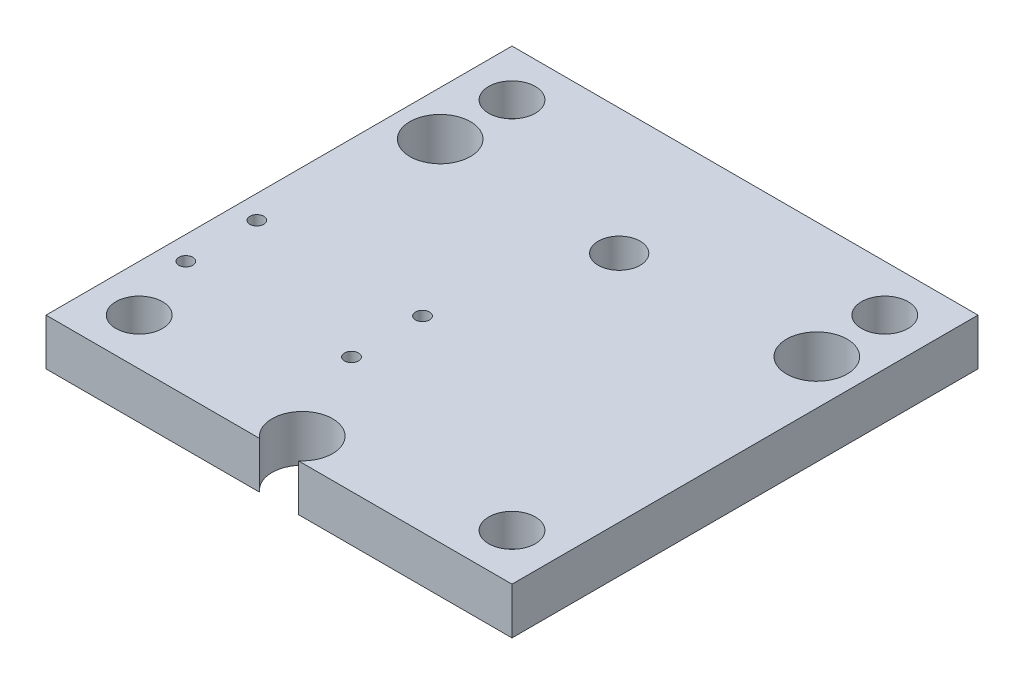
ISO-10303-21;
HEADER;
FILE_DESCRIPTION(('STEP AP214'),'2;1');
FILE_NAME('part.step','',(''),(''),'','','');
FILE_SCHEMA(('AUTOMOTIVE_DESIGN { 1 0 10303 214 1 1 1 1 }'));
ENDSEC;
DATA;
#1=APPLICATION_CONTEXT('core data for automotive mechanical design processes');
#2=APPLICATION_PROTOCOL_DEFINITION('international standard','automotive_design',2000,#1);
#3=PRODUCT_CONTEXT('',#1,'mechanical');
#4=PRODUCT('Part','Part','',(#3));
#5=PRODUCT_RELATED_PRODUCT_CATEGORY('part','',(#4));
#6=PRODUCT_DEFINITION_FORMATION('','',#4);
#7=PRODUCT_DEFINITION_CONTEXT('part definition',#1,'design');
#8=PRODUCT_DEFINITION('design','',#6,#7);
#9=PRODUCT_DEFINITION_SHAPE('','',#8);
#10=(LENGTH_UNIT() NAMED_UNIT(*) SI_UNIT(.MILLI.,.METRE.));
#11=(NAMED_UNIT(*) PLANE_ANGLE_UNIT() SI_UNIT($,.RADIAN.));
#12=(NAMED_UNIT(*) SI_UNIT($,.STERADIAN.) SOLID_ANGLE_UNIT());
#13=UNCERTAINTY_MEASURE_WITH_UNIT(LENGTH_MEASURE(1.E-05),#10,'distance_accuracy_value','');
#14=(GEOMETRIC_REPRESENTATION_CONTEXT(3) GLOBAL_UNCERTAINTY_ASSIGNED_CONTEXT((#13)) GLOBAL_UNIT_ASSIGNED_CONTEXT((#10,
#11,#12)) REPRESENTATION_CONTEXT('',''));
#15=CARTESIAN_POINT('',(0.,0.,0.));
#16=DIRECTION('',(0.,0.,1.));
#17=DIRECTION('',(1.,0.,0.));
#18=AXIS2_PLACEMENT_3D('',#15,#16,#17);
#19=CARTESIAN_POINT('',(50.,0.,27.));
#20=DIRECTION('',(0.,1.,0.));
#21=DIRECTION('',(0.,0.,1.));
#22=AXIS2_PLACEMENT_3D('',#19,#20,#21);
#23=CYLINDRICAL_SURFACE('',#22,4.5);
#24=CARTESIAN_POINT('',(50.,10.,27.));
#25=DIRECTION('',(0.,1.,0.));
#26=DIRECTION('',(0.,0.,1.));
#27=AXIS2_PLACEMENT_3D('',#24,#25,#26);
#28=CIRCLE('',#27,4.5);
#29=CARTESIAN_POINT('',(50.,10.,31.5));
#30=VERTEX_POINT('',#29);
#31=EDGE_CURVE('E197',#30,#30,#28,.T.);
#32=ORIENTED_EDGE('',*,*,#31,.T.);
#33=EDGE_LOOP('',(#32));
#34=FACE_BOUND('',#33,.T.);
#35=CARTESIAN_POINT('',(50.,3.,27.));
#36=DIRECTION('',(0.,-1.,0.));
#37=DIRECTION('',(0.,0.,-1.));
#38=AXIS2_PLACEMENT_3D('',#35,#36,#37);
#39=CIRCLE('',#38,4.5);
#40=CARTESIAN_POINT('',(50.,3.,22.5));
#41=VERTEX_POINT('',#40);
#42=EDGE_CURVE('E43',#41,#41,#39,.F.);
#43=ORIENTED_EDGE('',*,*,#42,.F.);
#44=EDGE_LOOP('',(#43));
#45=FACE_BOUND('',#44,.T.);
#46=ADVANCED_FACE('F39',(#34,#45),#23,.F.);
#47=CARTESIAN_POINT('',(0.,10.,100.));
#48=DIRECTION('',(0.,0.,-1.));
#49=DIRECTION('',(-1.,0.,0.));
#50=AXIS2_PLACEMENT_3D('',#47,#48,#49);
#51=PLANE('',#50);
#52=DIRECTION('',(1.,0.,0.));
#53=VECTOR('',#52,1.);
#54=CARTESIAN_POINT('',(0.,0.,100.));
#55=LINE('',#54,#53);
#56=CARTESIAN_POINT('',(0.,0.,100.));
#57=VERTEX_POINT('',#56);
#58=CARTESIAN_POINT('',(45.846688068541,0.,100.));
#59=VERTEX_POINT('',#58);
#60=EDGE_CURVE('E124',#57,#59,#55,.T.);
#61=ORIENTED_EDGE('',*,*,#60,.T.);
#62=DIRECTION('',(0.,1.,0.));
#63=VECTOR('',#62,1.);
#64=CARTESIAN_POINT('',(45.846688068541,0.,100.));
#65=LINE('',#64,#63);
#66=CARTESIAN_POINT('',(45.846688068541,10.,100.));
#67=VERTEX_POINT('',#66);
#68=EDGE_CURVE('E56',#59,#67,#65,.T.);
#69=ORIENTED_EDGE('',*,*,#68,.T.);
#70=DIRECTION('',(1.,0.,0.));
#71=VECTOR('',#70,1.);
#72=CARTESIAN_POINT('',(0.,10.,100.));
#73=LINE('',#72,#71);
#74=CARTESIAN_POINT('',(0.,10.,100.));
#75=VERTEX_POINT('',#74);
#76=EDGE_CURVE('E92',#75,#67,#73,.T.);
#77=ORIENTED_EDGE('',*,*,#76,.F.);
#78=DIRECTION('',(0.,-1.,0.));
#79=VECTOR('',#78,1.);
#80=CARTESIAN_POINT('',(0.,10.,100.));
#81=LINE('',#80,#79);
#82=EDGE_CURVE('E11',#75,#57,#81,.T.);
#83=ORIENTED_EDGE('',*,*,#82,.T.);
#84=EDGE_LOOP('',(#61,#69,#77,#83));
#85=FACE_BOUND('',#84,.T.);
#86=ADVANCED_FACE('F334',(#85),#51,.F.);
#87=CARTESIAN_POINT('',(0.,10.,0.));
#88=DIRECTION('',(1.,0.,0.));
#89=DIRECTION('',(0.,0.,-1.));
#90=AXIS2_PLACEMENT_3D('',#87,#88,#89);
#91=PLANE('',#90);
#92=DIRECTION('',(0.,0.,1.));
#93=VECTOR('',#92,1.);
#94=CARTESIAN_POINT('',(0.,0.,0.));
#95=LINE('',#94,#93);
#96=CARTESIAN_POINT('',(0.,0.,0.));
#97=VERTEX_POINT('',#96);
#98=EDGE_CURVE('E125',#97,#57,#95,.T.);
#99=ORIENTED_EDGE('',*,*,#98,.T.);
#100=ORIENTED_EDGE('',*,*,#82,.F.);
#101=DIRECTION('',(0.,0.,1.));
#102=VECTOR('',#101,1.);
#103=CARTESIAN_POINT('',(0.,10.,0.));
#104=LINE('',#103,#102);
#105=CARTESIAN_POINT('',(0.,10.,0.));
#106=VERTEX_POINT('',#105);
#107=EDGE_CURVE('E138',#106,#75,#104,.T.);
#108=ORIENTED_EDGE('',*,*,#107,.F.);
#109=DIRECTION('',(0.,-1.,0.));
#110=VECTOR('',#109,1.);
#111=CARTESIAN_POINT('',(0.,10.,0.));
#112=LINE('',#111,#110);
#113=EDGE_CURVE('E139',#106,#97,#112,.T.);
#114=ORIENTED_EDGE('',*,*,#113,.T.);
#115=EDGE_LOOP('',(#99,#100,#108,#114));
#116=FACE_BOUND('',#115,.T.);
#117=ADVANCED_FACE('F41',(#116),#91,.F.);
#118=CARTESIAN_POINT('',(54.153311931459,10.,100.));
#119=VERTEX_POINT('',#118);
#120=CARTESIAN_POINT('',(100.,10.,100.));
#121=VERTEX_POINT('',#120);
#122=EDGE_CURVE('E117',#119,#121,#73,.T.);
#123=ORIENTED_EDGE('',*,*,#122,.F.);
#124=DIRECTION('',(0.,1.,0.));
#125=VECTOR('',#124,1.);
#126=CARTESIAN_POINT('',(54.153311931459,0.,100.));
#127=LINE('',#126,#125);
#128=CARTESIAN_POINT('',(54.153311931459,0.,100.));
#129=VERTEX_POINT('',#128);
#130=EDGE_CURVE('E103',#119,#129,#127,.F.);
#131=ORIENTED_EDGE('',*,*,#130,.T.);
#132=CARTESIAN_POINT('',(100.,0.,100.));
#133=VERTEX_POINT('',#132);
#134=EDGE_CURVE('E115',#129,#133,#55,.T.);
#135=ORIENTED_EDGE('',*,*,#134,.T.);
#136=DIRECTION('',(0.,-1.,0.));
#137=VECTOR('',#136,1.);
#138=CARTESIAN_POINT('',(100.,10.,100.));
#139=LINE('',#138,#137);
#140=EDGE_CURVE('E49',#121,#133,#139,.T.);
#141=ORIENTED_EDGE('',*,*,#140,.F.);
#142=EDGE_LOOP('',(#123,#131,#135,#141));
#143=FACE_BOUND('',#142,.T.);
#144=ADVANCED_FACE('F113',(#143),#51,.F.);
#145=CARTESIAN_POINT('',(100.,10.,0.));
#146=DIRECTION('',(-1.,0.,0.));
#147=DIRECTION('',(0.,0.,1.));
#148=AXIS2_PLACEMENT_3D('',#145,#146,#147);
#149=PLANE('',#148);
#150=DIRECTION('',(0.,0.,-1.));
#151=VECTOR('',#150,1.);
#152=CARTESIAN_POINT('',(100.,0.,0.));
#153=LINE('',#152,#151);
#154=CARTESIAN_POINT('',(100.,0.,0.));
#155=VERTEX_POINT('',#154);
#156=EDGE_CURVE('E122',#133,#155,#153,.T.);
#157=ORIENTED_EDGE('',*,*,#156,.T.);
#158=DIRECTION('',(0.,-1.,0.));
#159=VECTOR('',#158,1.);
#160=CARTESIAN_POINT('',(100.,10.,0.));
#161=LINE('',#160,#159);
#162=CARTESIAN_POINT('',(100.,10.,0.));
#163=VERTEX_POINT('',#162);
#164=EDGE_CURVE('E142',#163,#155,#161,.T.);
#165=ORIENTED_EDGE('',*,*,#164,.F.);
#166=DIRECTION('',(0.,0.,-1.));
#167=VECTOR('',#166,1.);
#168=CARTESIAN_POINT('',(100.,10.,0.));
#169=LINE('',#168,#167);
#170=EDGE_CURVE('E150',#121,#163,#169,.T.);
#171=ORIENTED_EDGE('',*,*,#170,.F.);
#172=ORIENTED_EDGE('',*,*,#140,.T.);
#173=EDGE_LOOP('',(#157,#165,#171,#172));
#174=FACE_BOUND('',#173,.T.);
#175=ADVANCED_FACE('F148',(#174),#149,.F.);
#176=CARTESIAN_POINT('',(0.,10.,0.));
#177=DIRECTION('',(0.,0.,1.));
#178=DIRECTION('',(1.,0.,0.));
#179=AXIS2_PLACEMENT_3D('',#176,#177,#178);
#180=PLANE('',#179);
#181=DIRECTION('',(-1.,0.,0.));
#182=VECTOR('',#181,1.);
#183=CARTESIAN_POINT('',(0.,0.,0.));
#184=LINE('',#183,#182);
#185=EDGE_CURVE('E86',#155,#97,#184,.T.);
#186=ORIENTED_EDGE('',*,*,#185,.T.);
#187=ORIENTED_EDGE('',*,*,#113,.F.);
#188=DIRECTION('',(-1.,0.,0.));
#189=VECTOR('',#188,1.);
#190=CARTESIAN_POINT('',(0.,10.,0.));
#191=LINE('',#190,#189);
#192=EDGE_CURVE('E65',#163,#106,#191,.T.);
#193=ORIENTED_EDGE('',*,*,#192,.F.);
#194=ORIENTED_EDGE('',*,*,#164,.T.);
#195=EDGE_LOOP('',(#186,#187,#193,#194));
#196=FACE_BOUND('',#195,.T.);
#197=ADVANCED_FACE('F311',(#196),#180,.F.);
#198=CARTESIAN_POINT('',(0.,10.,0.));
#199=DIRECTION('',(0.,1.,0.));
#200=DIRECTION('',(0.,0.,1.));
#201=AXIS2_PLACEMENT_3D('',#198,#199,#200);
#202=PLANE('',#201);
#203=CARTESIAN_POINT('',(40.56,10.,75.));
#204=DIRECTION('',(0.,1.,0.));
#205=DIRECTION('',(0.,0.,1.));
#206=AXIS2_PLACEMENT_3D('',#203,#204,#205);
#207=CIRCLE('',#206,1.5);
#208=CARTESIAN_POINT('',(40.56,10.,76.5));
#209=VERTEX_POINT('',#208);
#210=EDGE_CURVE('E240',#209,#209,#207,.T.);
#211=ORIENTED_EDGE('',*,*,#210,.F.);
#212=EDGE_LOOP('',(#211));
#213=FACE_BOUND('',#212,.T.);
#214=CARTESIAN_POINT('',(5.,10.,59.76));
#215=DIRECTION('',(0.,1.,0.));
#216=DIRECTION('',(0.,0.,1.));
#217=AXIS2_PLACEMENT_3D('',#214,#215,#216);
#218=CIRCLE('',#217,1.5);
#219=CARTESIAN_POINT('',(5.,10.,61.26));
#220=VERTEX_POINT('',#219);
#221=EDGE_CURVE('E231',#220,#220,#218,.T.);
#222=ORIENTED_EDGE('',*,*,#221,.F.);
#223=EDGE_LOOP('',(#222));
#224=FACE_BOUND('',#223,.T.);
#225=CARTESIAN_POINT('',(5.,10.,75.));
#226=DIRECTION('',(0.,1.,0.));
#227=DIRECTION('',(0.,0.,1.));
#228=AXIS2_PLACEMENT_3D('',#225,#226,#227);
#229=CIRCLE('',#228,1.5);
#230=CARTESIAN_POINT('',(5.,10.,76.5));
#231=VERTEX_POINT('',#230);
#232=EDGE_CURVE('E247',#231,#231,#229,.T.);
#233=ORIENTED_EDGE('',*,*,#232,.F.);
#234=EDGE_LOOP('',(#233));
#235=FACE_BOUND('',#234,.T.);
#236=CARTESIAN_POINT('',(40.56,10.,59.76));
#237=DIRECTION('',(0.,1.,0.));
#238=DIRECTION('',(0.,0.,1.));
#239=AXIS2_PLACEMENT_3D('',#236,#237,#238);
#240=CIRCLE('',#239,1.5);
#241=CARTESIAN_POINT('',(40.56,10.,61.26));
#242=VERTEX_POINT('',#241);
#243=EDGE_CURVE('E223',#242,#242,#240,.T.);
#244=ORIENTED_EDGE('',*,*,#243,.F.);
#245=EDGE_LOOP('',(#244));
#246=FACE_BOUND('',#245,.T.);
#247=ORIENTED_EDGE('',*,*,#31,.F.);
#248=EDGE_LOOP('',(#247));
#249=FACE_BOUND('',#248,.T.);
#250=CARTESIAN_POINT('',(50.,10.,95.));
#251=DIRECTION('',(0.,1.,0.));
#252=DIRECTION('',(0.,0.,1.));
#253=AXIS2_PLACEMENT_3D('',#250,#251,#252);
#254=CIRCLE('',#253,6.5);
#255=EDGE_CURVE('E109',#119,#67,#254,.T.);
#256=ORIENTED_EDGE('',*,*,#255,.F.);
#257=ORIENTED_EDGE('',*,*,#122,.T.);
#258=ORIENTED_EDGE('',*,*,#170,.T.);
#259=ORIENTED_EDGE('',*,*,#192,.T.);
#260=ORIENTED_EDGE('',*,*,#107,.T.);
#261=ORIENTED_EDGE('',*,*,#76,.T.);
#262=EDGE_LOOP('',(#256,#257,#258,#259,#260,#261));
#263=FACE_BOUND('',#262,.T.);
#264=CARTESIAN_POINT('',(90.4145188432738,10.,25.));
#265=DIRECTION('',(0.,1.,0.));
#266=DIRECTION('',(0.,0.,1.));
#267=AXIS2_PLACEMENT_3D('',#264,#265,#266);
#268=CIRCLE('',#267,6.5);
#269=CARTESIAN_POINT('',(90.4145188432738,10.,31.5));
#270=VERTEX_POINT('',#269);
#271=EDGE_CURVE('E201',#270,#270,#268,.T.);
#272=ORIENTED_EDGE('',*,*,#271,.F.);
#273=EDGE_LOOP('',(#272));
#274=FACE_BOUND('',#273,.T.);
#275=CARTESIAN_POINT('',(9.58548115672619,10.,25.));
#276=DIRECTION('',(0.,1.,0.));
#277=DIRECTION('',(0.,0.,1.));
#278=AXIS2_PLACEMENT_3D('',#275,#276,#277);
#279=CIRCLE('',#278,6.5);
#280=CARTESIAN_POINT('',(9.58548115672619,10.,31.5));
#281=VERTEX_POINT('',#280);
#282=EDGE_CURVE('E192',#281,#281,#279,.T.);
#283=ORIENTED_EDGE('',*,*,#282,.F.);
#284=EDGE_LOOP('',(#283));
#285=FACE_BOUND('',#284,.T.);
#286=CARTESIAN_POINT('',(90.,10.,9.99999999999998));
#287=DIRECTION('',(0.,1.,0.));
#288=DIRECTION('',(0.,0.,1.));
#289=AXIS2_PLACEMENT_3D('',#286,#287,#288);
#290=CIRCLE('',#289,5.);
#291=CARTESIAN_POINT('',(90.,10.,15.));
#292=VERTEX_POINT('',#291);
#293=EDGE_CURVE('E176',#292,#292,#290,.T.);
#294=ORIENTED_EDGE('',*,*,#293,.F.);
#295=EDGE_LOOP('',(#294));
#296=FACE_BOUND('',#295,.T.);
#297=CARTESIAN_POINT('',(10.,10.,90.));
#298=DIRECTION('',(0.,1.,0.));
#299=DIRECTION('',(0.,0.,1.));
#300=AXIS2_PLACEMENT_3D('',#297,#298,#299);
#301=CIRCLE('',#300,5.);
#302=CARTESIAN_POINT('',(10.,10.,95.));
#303=VERTEX_POINT('',#302);
#304=EDGE_CURVE('E167',#303,#303,#301,.T.);
#305=ORIENTED_EDGE('',*,*,#304,.F.);
#306=EDGE_LOOP('',(#305));
#307=FACE_BOUND('',#306,.T.);
#308=CARTESIAN_POINT('',(90.,10.,90.));
#309=DIRECTION('',(0.,1.,0.));
#310=DIRECTION('',(0.,0.,1.));
#311=AXIS2_PLACEMENT_3D('',#308,#309,#310);
#312=CIRCLE('',#311,5.00000000000001);
#313=CARTESIAN_POINT('',(90.,10.,95.));
#314=VERTEX_POINT('',#313);
#315=EDGE_CURVE('E183',#314,#314,#312,.T.);
#316=ORIENTED_EDGE('',*,*,#315,.F.);
#317=EDGE_LOOP('',(#316));
#318=FACE_BOUND('',#317,.T.);
#319=CARTESIAN_POINT('',(9.99999999999999,10.,10.));
#320=DIRECTION('',(0.,1.,0.));
#321=DIRECTION('',(0.,0.,1.));
#322=AXIS2_PLACEMENT_3D('',#319,#320,#321);
#323=CIRCLE('',#322,5.);
#324=CARTESIAN_POINT('',(9.99999999999999,10.,15.));
#325=VERTEX_POINT('',#324);
#326=EDGE_CURVE('E159',#325,#325,#323,.T.);
#327=ORIENTED_EDGE('',*,*,#326,.F.);
#328=EDGE_LOOP('',(#327));
#329=FACE_BOUND('',#328,.T.);
#330=ADVANCED_FACE('F283',(#213,#224,#235,#246,#249,#263,#274,#285,#296,#307,#318,#329),#202,.T.);
#331=CARTESIAN_POINT('',(0.,0.,0.));
#332=DIRECTION('',(0.,1.,0.));
#333=DIRECTION('',(0.,0.,1.));
#334=AXIS2_PLACEMENT_3D('',#331,#332,#333);
#335=PLANE('',#334);
#336=CARTESIAN_POINT('',(65.,0.,27.));
#337=DIRECTION('',(0.,-1.,0.));
#338=DIRECTION('',(0.,0.,-1.));
#339=AXIS2_PLACEMENT_3D('',#336,#337,#338);
#340=CIRCLE('',#339,1.4);
#341=CARTESIAN_POINT('',(65.,0.,25.6));
#342=VERTEX_POINT('',#341);
#343=EDGE_CURVE('E263',#342,#342,#340,.T.);
#344=ORIENTED_EDGE('',*,*,#343,.F.);
#345=EDGE_LOOP('',(#344));
#346=FACE_BOUND('',#345,.T.);
#347=CARTESIAN_POINT('',(35.,0.,27.));
#348=DIRECTION('',(0.,-1.,0.));
#349=DIRECTION('',(0.,0.,-1.));
#350=AXIS2_PLACEMENT_3D('',#347,#348,#349);
#351=CIRCLE('',#350,1.4);
#352=CARTESIAN_POINT('',(35.,0.,25.6));
#353=VERTEX_POINT('',#352);
#354=EDGE_CURVE('E255',#353,#353,#351,.T.);
#355=ORIENTED_EDGE('',*,*,#354,.F.);
#356=EDGE_LOOP('',(#355));
#357=FACE_BOUND('',#356,.T.);
#358=CARTESIAN_POINT('',(40.56,0.,75.));
#359=DIRECTION('',(0.,1.,0.));
#360=DIRECTION('',(0.,0.,1.));
#361=AXIS2_PLACEMENT_3D('',#358,#359,#360);
#362=CIRCLE('',#361,1.5);
#363=CARTESIAN_POINT('',(40.56,0.,76.5));
#364=VERTEX_POINT('',#363);
#365=EDGE_CURVE('E227',#364,#364,#362,.T.);
#366=ORIENTED_EDGE('',*,*,#365,.T.);
#367=EDGE_LOOP('',(#366));
#368=FACE_BOUND('',#367,.T.);
#369=CARTESIAN_POINT('',(5.,0.,59.76));
#370=DIRECTION('',(0.,1.,0.));
#371=DIRECTION('',(0.,0.,1.));
#372=AXIS2_PLACEMENT_3D('',#369,#370,#371);
#373=CIRCLE('',#372,1.5);
#374=CARTESIAN_POINT('',(5.,0.,61.26));
#375=VERTEX_POINT('',#374);
#376=EDGE_CURVE('E235',#375,#375,#373,.T.);
#377=ORIENTED_EDGE('',*,*,#376,.T.);
#378=EDGE_LOOP('',(#377));
#379=FACE_BOUND('',#378,.T.);
#380=CARTESIAN_POINT('',(5.,0.,75.));
#381=DIRECTION('',(0.,1.,0.));
#382=DIRECTION('',(0.,0.,1.));
#383=AXIS2_PLACEMENT_3D('',#380,#381,#382);
#384=CIRCLE('',#383,1.5);
#385=CARTESIAN_POINT('',(5.,0.,76.5));
#386=VERTEX_POINT('',#385);
#387=EDGE_CURVE('E236',#386,#386,#384,.T.);
#388=ORIENTED_EDGE('',*,*,#387,.T.);
#389=EDGE_LOOP('',(#388));
#390=FACE_BOUND('',#389,.T.);
#391=CARTESIAN_POINT('',(40.56,0.,59.76));
#392=DIRECTION('',(0.,1.,0.));
#393=DIRECTION('',(0.,0.,1.));
#394=AXIS2_PLACEMENT_3D('',#391,#392,#393);
#395=CIRCLE('',#394,1.5);
#396=CARTESIAN_POINT('',(40.56,0.,61.26));
#397=VERTEX_POINT('',#396);
#398=EDGE_CURVE('E219',#397,#397,#395,.T.);
#399=ORIENTED_EDGE('',*,*,#398,.T.);
#400=EDGE_LOOP('',(#399));
#401=FACE_BOUND('',#400,.T.);
#402=CARTESIAN_POINT('',(50.,0.,27.));
#403=DIRECTION('',(0.,-1.,0.));
#404=DIRECTION('',(0.,0.,-1.));
#405=AXIS2_PLACEMENT_3D('',#402,#403,#404);
#406=CIRCLE('',#405,6.5);
#407=CARTESIAN_POINT('',(50.,0.,20.5));
#408=VERTEX_POINT('',#407);
#409=EDGE_CURVE('E214',#408,#408,#406,.T.);
#410=ORIENTED_EDGE('',*,*,#409,.F.);
#411=EDGE_LOOP('',(#410));
#412=FACE_BOUND('',#411,.T.);
#413=CARTESIAN_POINT('',(90.4145188432738,0.,25.));
#414=DIRECTION('',(0.,1.,0.));
#415=DIRECTION('',(0.,0.,1.));
#416=AXIS2_PLACEMENT_3D('',#413,#414,#415);
#417=CIRCLE('',#416,6.5);
#418=CARTESIAN_POINT('',(90.4145188432738,0.,31.5));
#419=VERTEX_POINT('',#418);
#420=EDGE_CURVE('E205',#419,#419,#417,.T.);
#421=ORIENTED_EDGE('',*,*,#420,.T.);
#422=EDGE_LOOP('',(#421));
#423=FACE_BOUND('',#422,.T.);
#424=CARTESIAN_POINT('',(9.58548115672619,0.,25.));
#425=DIRECTION('',(0.,1.,0.));
#426=DIRECTION('',(0.,0.,1.));
#427=AXIS2_PLACEMENT_3D('',#424,#425,#426);
#428=CIRCLE('',#427,6.5);
#429=CARTESIAN_POINT('',(9.58548115672619,0.,31.5));
#430=VERTEX_POINT('',#429);
#431=EDGE_CURVE('E196',#430,#430,#428,.T.);
#432=ORIENTED_EDGE('',*,*,#431,.T.);
#433=EDGE_LOOP('',(#432));
#434=FACE_BOUND('',#433,.T.);
#435=ORIENTED_EDGE('',*,*,#134,.F.);
#436=CARTESIAN_POINT('',(50.,0.,95.));
#437=DIRECTION('',(0.,1.,0.));
#438=DIRECTION('',(0.,0.,1.));
#439=AXIS2_PLACEMENT_3D('',#436,#437,#438);
#440=CIRCLE('',#439,6.5);
#441=EDGE_CURVE('E100',#129,#59,#440,.T.);
#442=ORIENTED_EDGE('',*,*,#441,.T.);
#443=ORIENTED_EDGE('',*,*,#60,.F.);
#444=ORIENTED_EDGE('',*,*,#98,.F.);
#445=ORIENTED_EDGE('',*,*,#185,.F.);
#446=ORIENTED_EDGE('',*,*,#156,.F.);
#447=EDGE_LOOP('',(#435,#442,#443,#444,#445,#446));
#448=FACE_BOUND('',#447,.T.);
#449=ADVANCED_FACE('F121',(#346,#357,#368,#379,#390,#401,#412,#423,#434,#448),#335,.F.);
#450=CARTESIAN_POINT('',(9.99999999999999,3.,10.));
#451=DIRECTION('',(0.,1.,0.));
#452=DIRECTION('',(0.,0.,1.));
#453=AXIS2_PLACEMENT_3D('',#450,#451,#452);
#454=CYLINDRICAL_SURFACE('',#453,5.);
#455=CARTESIAN_POINT('',(9.99999999999999,3.,10.));
#456=DIRECTION('',(0.,1.,0.));
#457=DIRECTION('',(0.,0.,1.));
#458=AXIS2_PLACEMENT_3D('',#455,#456,#457);
#459=CIRCLE('',#458,5.);
#460=CARTESIAN_POINT('',(9.99999999999999,3.,15.));
#461=VERTEX_POINT('',#460);
#462=EDGE_CURVE('E130',#461,#461,#459,.T.);
#463=ORIENTED_EDGE('',*,*,#462,.F.);
#464=EDGE_LOOP('',(#463));
#465=FACE_BOUND('',#464,.T.);
#466=ORIENTED_EDGE('',*,*,#326,.T.);
#467=EDGE_LOOP('',(#466));
#468=FACE_BOUND('',#467,.T.);
#469=ADVANCED_FACE('F282',(#465,#468),#454,.F.);
#470=CARTESIAN_POINT('',(9.99999999999999,3.,10.));
#471=DIRECTION('',(0.,1.,0.));
#472=DIRECTION('',(0.,0.,1.));
#473=AXIS2_PLACEMENT_3D('',#470,#471,#472);
#474=PLANE('',#473);
#475=ORIENTED_EDGE('',*,*,#462,.T.);
#476=EDGE_LOOP('',(#475));
#477=FACE_BOUND('',#476,.T.);
#478=ADVANCED_FACE('F323',(#477),#474,.T.);
#479=CARTESIAN_POINT('',(90.,3.,90.));
#480=DIRECTION('',(0.,1.,0.));
#481=DIRECTION('',(0.,0.,1.));
#482=AXIS2_PLACEMENT_3D('',#479,#480,#481);
#483=CYLINDRICAL_SURFACE('',#482,5.00000000000001);
#484=CARTESIAN_POINT('',(90.,3.,90.));
#485=DIRECTION('',(0.,1.,0.));
#486=DIRECTION('',(0.,0.,1.));
#487=AXIS2_PLACEMENT_3D('',#484,#485,#486);
#488=CIRCLE('',#487,5.00000000000001);
#489=CARTESIAN_POINT('',(90.,3.,95.));
#490=VERTEX_POINT('',#489);
#491=EDGE_CURVE('E172',#490,#490,#488,.T.);
#492=ORIENTED_EDGE('',*,*,#491,.F.);
#493=EDGE_LOOP('',(#492));
#494=FACE_BOUND('',#493,.T.);
#495=ORIENTED_EDGE('',*,*,#315,.T.);
#496=EDGE_LOOP('',(#495));
#497=FACE_BOUND('',#496,.T.);
#498=ADVANCED_FACE('F329',(#494,#497),#483,.F.);
#499=CARTESIAN_POINT('',(90.,3.,90.));
#500=DIRECTION('',(0.,1.,0.));
#501=DIRECTION('',(0.,0.,1.));
#502=AXIS2_PLACEMENT_3D('',#499,#500,#501);
#503=PLANE('',#502);
#504=ORIENTED_EDGE('',*,*,#491,.T.);
#505=EDGE_LOOP('',(#504));
#506=FACE_BOUND('',#505,.T.);
#507=ADVANCED_FACE('F351',(#506),#503,.T.);
#508=CARTESIAN_POINT('',(10.,3.,90.));
#509=DIRECTION('',(0.,1.,0.));
#510=DIRECTION('',(0.,0.,1.));
#511=AXIS2_PLACEMENT_3D('',#508,#509,#510);
#512=CYLINDRICAL_SURFACE('',#511,5.);
#513=CARTESIAN_POINT('',(10.,3.,90.));
#514=DIRECTION('',(0.,1.,0.));
#515=DIRECTION('',(0.,0.,1.));
#516=AXIS2_PLACEMENT_3D('',#513,#514,#515);
#517=CIRCLE('',#516,5.);
#518=CARTESIAN_POINT('',(10.,3.,95.));
#519=VERTEX_POINT('',#518);
#520=EDGE_CURVE('E171',#519,#519,#517,.T.);
#521=ORIENTED_EDGE('',*,*,#520,.F.);
#522=EDGE_LOOP('',(#521));
#523=FACE_BOUND('',#522,.T.);
#524=ORIENTED_EDGE('',*,*,#304,.T.);
#525=EDGE_LOOP('',(#524));
#526=FACE_BOUND('',#525,.T.);
#527=ADVANCED_FACE('F354',(#523,#526),#512,.F.);
#528=CARTESIAN_POINT('',(10.,3.,90.));
#529=DIRECTION('',(0.,1.,0.));
#530=DIRECTION('',(0.,0.,1.));
#531=AXIS2_PLACEMENT_3D('',#528,#529,#530);
#532=PLANE('',#531);
#533=ORIENTED_EDGE('',*,*,#520,.T.);
#534=EDGE_LOOP('',(#533));
#535=FACE_BOUND('',#534,.T.);
#536=ADVANCED_FACE('F365',(#535),#532,.T.);
#537=CARTESIAN_POINT('',(90.,3.,9.99999999999998));
#538=DIRECTION('',(0.,1.,0.));
#539=DIRECTION('',(0.,0.,1.));
#540=AXIS2_PLACEMENT_3D('',#537,#538,#539);
#541=CYLINDRICAL_SURFACE('',#540,5.);
#542=CARTESIAN_POINT('',(90.,3.,9.99999999999998));
#543=DIRECTION('',(0.,1.,0.));
#544=DIRECTION('',(0.,0.,1.));
#545=AXIS2_PLACEMENT_3D('',#542,#543,#544);
#546=CIRCLE('',#545,5.);
#547=CARTESIAN_POINT('',(90.,3.,15.));
#548=VERTEX_POINT('',#547);
#549=EDGE_CURVE('E163',#548,#548,#546,.T.);
#550=ORIENTED_EDGE('',*,*,#549,.F.);
#551=EDGE_LOOP('',(#550));
#552=FACE_BOUND('',#551,.T.);
#553=ORIENTED_EDGE('',*,*,#293,.T.);
#554=EDGE_LOOP('',(#553));
#555=FACE_BOUND('',#554,.T.);
#556=ADVANCED_FACE('F361',(#552,#555),#541,.F.);
#557=CARTESIAN_POINT('',(90.,3.,9.99999999999998));
#558=DIRECTION('',(0.,1.,0.));
#559=DIRECTION('',(0.,0.,1.));
#560=AXIS2_PLACEMENT_3D('',#557,#558,#559);
#561=PLANE('',#560);
#562=ORIENTED_EDGE('',*,*,#549,.T.);
#563=EDGE_LOOP('',(#562));
#564=FACE_BOUND('',#563,.T.);
#565=ADVANCED_FACE('F305',(#564),#561,.T.);
#566=CARTESIAN_POINT('',(9.58548115672619,0.,25.));
#567=DIRECTION('',(0.,1.,0.));
#568=DIRECTION('',(0.,0.,1.));
#569=AXIS2_PLACEMENT_3D('',#566,#567,#568);
#570=CYLINDRICAL_SURFACE('',#569,6.5);
#571=ORIENTED_EDGE('',*,*,#431,.F.);
#572=EDGE_LOOP('',(#571));
#573=FACE_BOUND('',#572,.T.);
#574=ORIENTED_EDGE('',*,*,#282,.T.);
#575=EDGE_LOOP('',(#574));
#576=FACE_BOUND('',#575,.T.);
#577=ADVANCED_FACE('F301',(#573,#576),#570,.F.);
#578=CARTESIAN_POINT('',(90.4145188432738,0.,25.));
#579=DIRECTION('',(0.,1.,0.));
#580=DIRECTION('',(0.,0.,1.));
#581=AXIS2_PLACEMENT_3D('',#578,#579,#580);
#582=CYLINDRICAL_SURFACE('',#581,6.5);
#583=ORIENTED_EDGE('',*,*,#420,.F.);
#584=EDGE_LOOP('',(#583));
#585=FACE_BOUND('',#584,.T.);
#586=ORIENTED_EDGE('',*,*,#271,.T.);
#587=EDGE_LOOP('',(#586));
#588=FACE_BOUND('',#587,.T.);
#589=ADVANCED_FACE('F304',(#585,#588),#582,.F.);
#590=CARTESIAN_POINT('',(50.,0.,95.));
#591=DIRECTION('',(0.,1.,0.));
#592=DIRECTION('',(0.,0.,1.));
#593=AXIS2_PLACEMENT_3D('',#590,#591,#592);
#594=CYLINDRICAL_SURFACE('',#593,6.5);
#595=ORIENTED_EDGE('',*,*,#441,.F.);
#596=ORIENTED_EDGE('',*,*,#130,.F.);
#597=ORIENTED_EDGE('',*,*,#255,.T.);
#598=ORIENTED_EDGE('',*,*,#68,.F.);
#599=EDGE_LOOP('',(#595,#596,#597,#598));
#600=FACE_BOUND('',#599,.T.);
#601=ADVANCED_FACE('F102',(#600),#594,.F.);
#602=CARTESIAN_POINT('',(50.,3.,27.));
#603=DIRECTION('',(0.,-1.,0.));
#604=DIRECTION('',(0.,0.,-1.));
#605=AXIS2_PLACEMENT_3D('',#602,#603,#604);
#606=PLANE('',#605);
#607=CARTESIAN_POINT('',(50.,3.,27.));
#608=DIRECTION('',(0.,-1.,0.));
#609=DIRECTION('',(0.,0.,-1.));
#610=AXIS2_PLACEMENT_3D('',#607,#608,#609);
#611=CIRCLE('',#610,6.5);
#612=CARTESIAN_POINT('',(50.,3.,20.5));
#613=VERTEX_POINT('',#612);
#614=EDGE_CURVE('E218',#613,#613,#611,.T.);
#615=ORIENTED_EDGE('',*,*,#614,.T.);
#616=EDGE_LOOP('',(#615));
#617=FACE_BOUND('',#616,.T.);
#618=ORIENTED_EDGE('',*,*,#42,.T.);
#619=EDGE_LOOP('',(#618));
#620=FACE_BOUND('',#619,.T.);
#621=ADVANCED_FACE('F347',(#617,#620),#606,.T.);
#622=CARTESIAN_POINT('',(50.,3.,27.));
#623=DIRECTION('',(0.,-1.,0.));
#624=DIRECTION('',(0.,0.,-1.));
#625=AXIS2_PLACEMENT_3D('',#622,#623,#624);
#626=CYLINDRICAL_SURFACE('',#625,6.5);
#627=ORIENTED_EDGE('',*,*,#614,.F.);
#628=EDGE_LOOP('',(#627));
#629=FACE_BOUND('',#628,.T.);
#630=ORIENTED_EDGE('',*,*,#409,.T.);
#631=EDGE_LOOP('',(#630));
#632=FACE_BOUND('',#631,.T.);
#633=ADVANCED_FACE('F343',(#629,#632),#626,.F.);
#634=CARTESIAN_POINT('',(40.56,0.,59.76));
#635=DIRECTION('',(0.,1.,0.));
#636=DIRECTION('',(0.,0.,1.));
#637=AXIS2_PLACEMENT_3D('',#634,#635,#636);
#638=CYLINDRICAL_SURFACE('',#637,1.5);
#639=ORIENTED_EDGE('',*,*,#398,.F.);
#640=EDGE_LOOP('',(#639));
#641=FACE_BOUND('',#640,.T.);
#642=ORIENTED_EDGE('',*,*,#243,.T.);
#643=EDGE_LOOP('',(#642));
#644=FACE_BOUND('',#643,.T.);
#645=ADVANCED_FACE('F416',(#641,#644),#638,.F.);
#646=CARTESIAN_POINT('',(5.,0.,75.));
#647=DIRECTION('',(0.,1.,0.));
#648=DIRECTION('',(0.,0.,1.));
#649=AXIS2_PLACEMENT_3D('',#646,#647,#648);
#650=CYLINDRICAL_SURFACE('',#649,1.5);
#651=ORIENTED_EDGE('',*,*,#387,.F.);
#652=EDGE_LOOP('',(#651));
#653=FACE_BOUND('',#652,.T.);
#654=ORIENTED_EDGE('',*,*,#232,.T.);
#655=EDGE_LOOP('',(#654));
#656=FACE_BOUND('',#655,.T.);
#657=ADVANCED_FACE('F424',(#653,#656),#650,.F.);
#658=CARTESIAN_POINT('',(5.,0.,59.76));
#659=DIRECTION('',(0.,1.,0.));
#660=DIRECTION('',(0.,0.,1.));
#661=AXIS2_PLACEMENT_3D('',#658,#659,#660);
#662=CYLINDRICAL_SURFACE('',#661,1.5);
#663=ORIENTED_EDGE('',*,*,#376,.F.);
#664=EDGE_LOOP('',(#663));
#665=FACE_BOUND('',#664,.T.);
#666=ORIENTED_EDGE('',*,*,#221,.T.);
#667=EDGE_LOOP('',(#666));
#668=FACE_BOUND('',#667,.T.);
#669=ADVANCED_FACE('F432',(#665,#668),#662,.F.);
#670=CARTESIAN_POINT('',(40.56,0.,75.));
#671=DIRECTION('',(0.,1.,0.));
#672=DIRECTION('',(0.,0.,1.));
#673=AXIS2_PLACEMENT_3D('',#670,#671,#672);
#674=CYLINDRICAL_SURFACE('',#673,1.5);
#675=ORIENTED_EDGE('',*,*,#365,.F.);
#676=EDGE_LOOP('',(#675));
#677=FACE_BOUND('',#676,.T.);
#678=ORIENTED_EDGE('',*,*,#210,.T.);
#679=EDGE_LOOP('',(#678));
#680=FACE_BOUND('',#679,.T.);
#681=ADVANCED_FACE('F440',(#677,#680),#674,.F.);
#682=CARTESIAN_POINT('',(35.,5.,27.));
#683=DIRECTION('',(0.,-1.,0.));
#684=DIRECTION('',(0.,0.,-1.));
#685=AXIS2_PLACEMENT_3D('',#682,#683,#684);
#686=CYLINDRICAL_SURFACE('',#685,1.4);
#687=CARTESIAN_POINT('',(35.,5.,27.));
#688=DIRECTION('',(0.,-1.,0.));
#689=DIRECTION('',(0.,0.,-1.));
#690=AXIS2_PLACEMENT_3D('',#687,#688,#689);
#691=CIRCLE('',#690,1.4);
#692=CARTESIAN_POINT('',(35.,5.,25.6));
#693=VERTEX_POINT('',#692);
#694=EDGE_CURVE('E259',#693,#693,#691,.T.);
#695=ORIENTED_EDGE('',*,*,#694,.F.);
#696=EDGE_LOOP('',(#695));
#697=FACE_BOUND('',#696,.T.);
#698=ORIENTED_EDGE('',*,*,#354,.T.);
#699=EDGE_LOOP('',(#698));
#700=FACE_BOUND('',#699,.T.);
#701=ADVANCED_FACE('F448',(#697,#700),#686,.F.);
#702=CARTESIAN_POINT('',(35.,5.,27.));
#703=DIRECTION('',(0.,-1.,0.));
#704=DIRECTION('',(0.,0.,-1.));
#705=AXIS2_PLACEMENT_3D('',#702,#703,#704);
#706=PLANE('',#705);
#707=ORIENTED_EDGE('',*,*,#694,.T.);
#708=EDGE_LOOP('',(#707));
#709=FACE_BOUND('',#708,.T.);
#710=ADVANCED_FACE('F276',(#709),#706,.T.);
#711=CARTESIAN_POINT('',(65.,5.,27.));
#712=DIRECTION('',(0.,-1.,0.));
#713=DIRECTION('',(0.,0.,-1.));
#714=AXIS2_PLACEMENT_3D('',#711,#712,#713);
#715=CYLINDRICAL_SURFACE('',#714,1.4);
#716=CARTESIAN_POINT('',(65.,5.,27.));
#717=DIRECTION('',(0.,-1.,0.));
#718=DIRECTION('',(0.,0.,-1.));
#719=AXIS2_PLACEMENT_3D('',#716,#717,#718);
#720=CIRCLE('',#719,1.4);
#721=CARTESIAN_POINT('',(65.,5.,25.6));
#722=VERTEX_POINT('',#721);
#723=EDGE_CURVE('E251',#722,#722,#720,.T.);
#724=ORIENTED_EDGE('',*,*,#723,.F.);
#725=EDGE_LOOP('',(#724));
#726=FACE_BOUND('',#725,.T.);
#727=ORIENTED_EDGE('',*,*,#343,.T.);
#728=EDGE_LOOP('',(#727));
#729=FACE_BOUND('',#728,.T.);
#730=ADVANCED_FACE('F273',(#726,#729),#715,.F.);
#731=CARTESIAN_POINT('',(65.,5.,27.));
#732=DIRECTION('',(0.,-1.,0.));
#733=DIRECTION('',(0.,0.,-1.));
#734=AXIS2_PLACEMENT_3D('',#731,#732,#733);
#735=PLANE('',#734);
#736=ORIENTED_EDGE('',*,*,#723,.T.);
#737=EDGE_LOOP('',(#736));
#738=FACE_BOUND('',#737,.T.);
#739=ADVANCED_FACE('F271',(#738),#735,.T.);
#740=CLOSED_SHELL('',(#46,#86,#117,#144,#175,#197,#330,#449,#469,#478,#498,#507,#527,#536,#556,
#565,#577,#589,#601,#621,#633,#645,#657,#669,#681,#701,#710,#730,#739));
#741=MANIFOLD_SOLID_BREP('B2',#740);
#742=ADVANCED_BREP_SHAPE_REPRESENTATION('',(#18,#741),#14);
#743=SHAPE_DEFINITION_REPRESENTATION(#9,#742);
ENDSEC;
END-ISO-10303-21;
